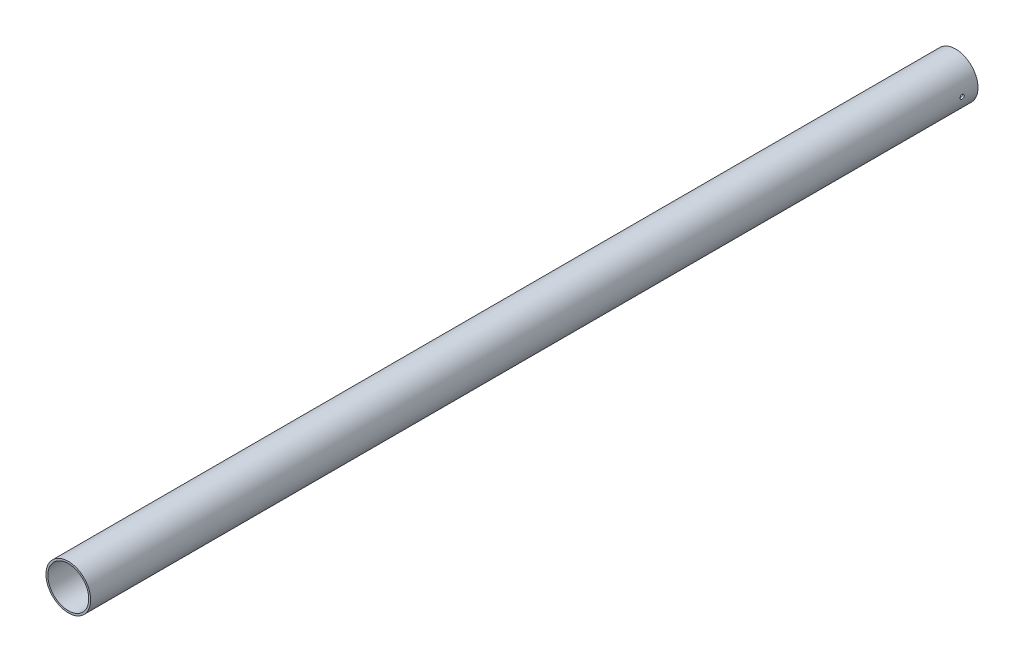
ISO-10303-21;
HEADER;
FILE_DESCRIPTION(('STEP AP214'),'2;1');
FILE_NAME('part.step','',(''),(''),'','','');
FILE_SCHEMA(('AUTOMOTIVE_DESIGN { 1 0 10303 214 1 1 1 1 }'));
ENDSEC;
DATA;
#1=APPLICATION_CONTEXT('core data for automotive mechanical design processes');
#2=APPLICATION_PROTOCOL_DEFINITION('international standard','automotive_design',2000,#1);
#3=PRODUCT_CONTEXT('',#1,'mechanical');
#4=PRODUCT('Part','Part','',(#3));
#5=PRODUCT_RELATED_PRODUCT_CATEGORY('part','',(#4));
#6=PRODUCT_DEFINITION_FORMATION('','',#4);
#7=PRODUCT_DEFINITION_CONTEXT('part definition',#1,'design');
#8=PRODUCT_DEFINITION('design','',#6,#7);
#9=PRODUCT_DEFINITION_SHAPE('','',#8);
#10=(LENGTH_UNIT() NAMED_UNIT(*) SI_UNIT(.MILLI.,.METRE.));
#11=(NAMED_UNIT(*) PLANE_ANGLE_UNIT() SI_UNIT($,.RADIAN.));
#12=(NAMED_UNIT(*) SI_UNIT($,.STERADIAN.) SOLID_ANGLE_UNIT());
#13=UNCERTAINTY_MEASURE_WITH_UNIT(LENGTH_MEASURE(1.E-05),#10,'distance_accuracy_value','');
#14=(GEOMETRIC_REPRESENTATION_CONTEXT(3) GLOBAL_UNCERTAINTY_ASSIGNED_CONTEXT((#13)) GLOBAL_UNIT_ASSIGNED_CONTEXT((#10,
#11,#12)) REPRESENTATION_CONTEXT('',''));
#15=CARTESIAN_POINT('',(0.,0.,0.));
#16=DIRECTION('',(0.,0.,1.));
#17=DIRECTION('',(1.,0.,0.));
#18=AXIS2_PLACEMENT_3D('',#15,#16,#17);
#19=CARTESIAN_POINT('',(0.,0.,504.28));
#20=DIRECTION('',(0.,0.,1.));
#21=DIRECTION('',(1.,0.,0.));
#22=AXIS2_PLACEMENT_3D('',#19,#20,#21);
#23=PLANE('',#22);
#24=CARTESIAN_POINT('',(0.,0.,504.28));
#25=DIRECTION('',(0.,0.,1.));
#26=DIRECTION('',(1.,0.,0.));
#27=AXIS2_PLACEMENT_3D('',#24,#25,#26);
#28=CIRCLE('',#27,12.7);
#29=CARTESIAN_POINT('',(12.7,0.,504.28));
#30=VERTEX_POINT('',#29);
#31=EDGE_CURVE('E47',#30,#30,#28,.T.);
#32=ORIENTED_EDGE('',*,*,#31,.T.);
#33=EDGE_LOOP('',(#32));
#34=FACE_BOUND('',#33,.T.);
#35=CARTESIAN_POINT('',(0.,0.,504.28));
#36=DIRECTION('',(0.,0.,1.));
#37=DIRECTION('',(1.,0.,0.));
#38=AXIS2_PLACEMENT_3D('',#35,#36,#37);
#39=CIRCLE('',#38,11.6205);
#40=CARTESIAN_POINT('',(11.6205,0.,504.28));
#41=VERTEX_POINT('',#40);
#42=EDGE_CURVE('E82',#41,#41,#39,.T.);
#43=ORIENTED_EDGE('',*,*,#42,.F.);
#44=EDGE_LOOP('',(#43));
#45=FACE_BOUND('',#44,.T.);
#46=ADVANCED_FACE('F31',(#34,#45),#23,.T.);
#47=CARTESIAN_POINT('',(0.,0.,0.));
#48=DIRECTION('',(0.,0.,1.));
#49=DIRECTION('',(1.,0.,0.));
#50=AXIS2_PLACEMENT_3D('',#47,#48,#49);
#51=PLANE('',#50);
#52=CARTESIAN_POINT('',(0.,0.,0.));
#53=DIRECTION('',(0.,0.,1.));
#54=DIRECTION('',(1.,0.,0.));
#55=AXIS2_PLACEMENT_3D('',#52,#53,#54);
#56=CIRCLE('',#55,12.7);
#57=CARTESIAN_POINT('',(12.7,0.,0.));
#58=VERTEX_POINT('',#57);
#59=EDGE_CURVE('E51',#58,#58,#56,.T.);
#60=ORIENTED_EDGE('',*,*,#59,.F.);
#61=EDGE_LOOP('',(#60));
#62=FACE_BOUND('',#61,.T.);
#63=CARTESIAN_POINT('',(0.,0.,0.));
#64=DIRECTION('',(0.,0.,1.));
#65=DIRECTION('',(1.,0.,0.));
#66=AXIS2_PLACEMENT_3D('',#63,#64,#65);
#67=CIRCLE('',#66,11.6205);
#68=CARTESIAN_POINT('',(11.6205,0.,0.));
#69=VERTEX_POINT('',#68);
#70=EDGE_CURVE('E77',#69,#69,#67,.T.);
#71=ORIENTED_EDGE('',*,*,#70,.T.);
#72=EDGE_LOOP('',(#71));
#73=FACE_BOUND('',#72,.T.);
#74=ADVANCED_FACE('F88',(#62,#73),#51,.F.);
#75=CARTESIAN_POINT('',(0.,0.,504.28));
#76=DIRECTION('',(0.,0.,-1.));
#77=DIRECTION('',(-1.,0.,0.));
#78=AXIS2_PLACEMENT_3D('',#75,#76,#77);
#79=CYLINDRICAL_SURFACE('',#78,12.7);
#80=CARTESIAN_POINT('',(-12.7,0.,7.8));
#81=CARTESIAN_POINT('',(-12.6999992647351,0.0672436645791881,7.80000292110959));
#82=CARTESIAN_POINT('',(-12.6994602583645,0.134532250113994,7.80567116161042));
#83=CARTESIAN_POINT('',(-12.6973618829489,0.267245238753763,7.82819805892377));
#84=CARTESIAN_POINT('',(-12.6958013786043,0.332667483068381,7.84506916697964));
#85=CARTESIAN_POINT('',(-12.6918362274279,0.459706661698656,7.88950742482808));
#86=CARTESIAN_POINT('',(-12.6894320792388,0.521325818618373,7.91706825737999));
#87=CARTESIAN_POINT('',(-12.6840487416453,0.63904956472979,7.98209167980071));
#88=CARTESIAN_POINT('',(-12.6810696696504,0.695155276339263,8.01955224854545));
#89=CARTESIAN_POINT('',(-12.6748596357844,0.800454668942981,8.10344191042882));
#90=CARTESIAN_POINT('',(-12.6716279754825,0.849628048880857,8.1498964363571));
#91=CARTESIAN_POINT('',(-12.6652827978562,0.939492536562182,8.25040123796989));
#92=CARTESIAN_POINT('',(-12.6621692859032,0.980183259034829,8.30445185847214));
#93=CARTESIAN_POINT('',(-12.6564056786671,1.05199827487853,8.41874031392843));
#94=CARTESIAN_POINT('',(-12.6537564692717,1.08310436467755,8.47898963589863));
#95=CARTESIAN_POINT('',(-12.6492298785415,1.13475088033833,8.60388544776417));
#96=CARTESIAN_POINT('',(-12.6473524800529,1.15529154102306,8.66853183989585));
#97=CARTESIAN_POINT('',(-12.6445882565911,1.18516434657597,8.80018078070263));
#98=CARTESIAN_POINT('',(-12.6436984725554,1.19452998010332,8.86717566721294));
#99=CARTESIAN_POINT('',(-12.6430009858318,1.2018903732235,9.0017919315644));
#100=CARTESIAN_POINT('',(-12.64319325756,1.19988540166057,9.06941329455553));
#101=CARTESIAN_POINT('',(-12.644635459794,1.18458912582194,9.20313261711031));
#102=CARTESIAN_POINT('',(-12.6458819693004,1.17133432672263,9.26923479460722));
#103=CARTESIAN_POINT('',(-12.6492868463526,1.1339714218254,9.39827206357135));
#104=CARTESIAN_POINT('',(-12.6514452250248,1.10986318359523,9.46120711638331));
#105=CARTESIAN_POINT('',(-12.6564345841342,1.05143724752191,9.58223931649146));
#106=CARTESIAN_POINT('',(-12.6592666343216,1.01710328976211,9.64032856873999));
#107=CARTESIAN_POINT('',(-12.6652833045372,0.939212226192871,9.74993385326778));
#108=CARTESIAN_POINT('',(-12.6684679337701,0.895654879561493,9.80144971386001));
#109=CARTESIAN_POINT('',(-12.6748461723438,0.800349280584357,9.89665804404941));
#110=CARTESIAN_POINT('',(-12.6780397677479,0.748569490103312,9.94031895044983));
#111=CARTESIAN_POINT('',(-12.6840642400147,0.638398534577093,10.0183335706764));
#112=CARTESIAN_POINT('',(-12.6868951165338,0.580007363270718,10.0526872756883));
#113=CARTESIAN_POINT('',(-12.6918759754523,0.458249762567131,10.1111108065502));
#114=CARTESIAN_POINT('',(-12.6940258565343,0.39488259459694,10.1351791023379));
#115=CARTESIAN_POINT('',(-12.6974014179635,0.264981758608645,10.1723258349013));
#116=CARTESIAN_POINT('',(-12.6986271229789,0.198448175158765,10.185404565011));
#117=CARTESIAN_POINT('',(-12.7000130615517,0.0643765766885857,10.2001610317479));
#118=CARTESIAN_POINT('',(-12.700177366823,-0.00315660256509824,10.2018823379735));
#119=CARTESIAN_POINT('',(-12.699432896081,-0.137550513798226,10.1939894255829));
#120=CARTESIAN_POINT('',(-12.6985241329862,-0.204411253863348,10.1843753434327));
#121=CARTESIAN_POINT('',(-12.695738284362,-0.335437135549339,10.1541206969873));
#122=CARTESIAN_POINT('',(-12.6938629842485,-0.399607012285763,10.1335004610956));
#123=CARTESIAN_POINT('',(-12.6893545416645,-0.523576627788468,10.081839685859));
#124=CARTESIAN_POINT('',(-12.6867213839395,-0.583376278558557,10.0507989367634));
#125=CARTESIAN_POINT('',(-12.6809818377794,-0.69710539349013,9.97906971127578));
#126=CARTESIAN_POINT('',(-12.677874051145,-0.751016678858039,9.93835252544696));
#127=CARTESIAN_POINT('',(-12.671538680543,-0.851254884069771,9.84846750987874));
#128=CARTESIAN_POINT('',(-12.6683110938964,-0.897581634190501,9.7992994910811));
#129=CARTESIAN_POINT('',(-12.662087709054,-0.981486362284095,9.69371876400525));
#130=CARTESIAN_POINT('',(-12.6590926875178,-1.01903580222673,9.63728332443466));
#131=CARTESIAN_POINT('',(-12.6536850894959,-1.08412401495575,9.51888222746228));
#132=CARTESIAN_POINT('',(-12.6512725057894,-1.11166291185015,9.45691663863365));
#133=CARTESIAN_POINT('',(-12.6473076389668,-1.15590024040374,9.32931320204592));
#134=CARTESIAN_POINT('',(-12.6457539952817,-1.17261582352431,9.26368134434372));
#135=CARTESIAN_POINT('',(-12.6436785869436,-1.19478774945327,9.13052713180316));
#136=CARTESIAN_POINT('',(-12.6431567961441,-1.20024437755629,9.06300482491151));
#137=CARTESIAN_POINT('',(-12.6432046673143,-1.19973977686572,8.92827005230846));
#138=CARTESIAN_POINT('',(-12.6437700436999,-1.19382338026117,8.86105741265753));
#139=CARTESIAN_POINT('',(-12.6459194194394,-1.17083449453073,8.72858526111938));
#140=CARTESIAN_POINT('',(-12.647503420095,-1.15376199114879,8.6633257517281));
#141=CARTESIAN_POINT('',(-12.6515104007557,-1.10895754365353,8.53661155895532));
#142=CARTESIAN_POINT('',(-12.6539332907887,-1.08122674262402,8.47515646837689));
#143=CARTESIAN_POINT('',(-12.6593452297627,-1.01589760947404,8.35776621977284));
#144=CARTESIAN_POINT('',(-12.662334273539,-0.978299367367613,8.30183101139945));
#145=CARTESIAN_POINT('',(-12.6685558185134,-0.894134111279764,8.196838600714));
#146=CARTESIAN_POINT('',(-12.6717891970951,-0.847533739505933,8.14780819064974));
#147=CARTESIAN_POINT('',(-12.6781270617199,-0.746751576404293,8.0582424423319));
#148=CARTESIAN_POINT('',(-12.6812315165959,-0.692567965517046,8.01770914876575));
#149=CARTESIAN_POINT('',(-12.6869689662881,-0.578024127382161,7.94621723636115));
#150=CARTESIAN_POINT('',(-12.6896008678755,-0.51765007272362,7.91528070193364));
#151=CARTESIAN_POINT('',(-12.6940845081993,-0.39257889087562,7.86402498077978));
#152=CARTESIAN_POINT('',(-12.6959371321351,-0.327886766038709,7.84369374091456));
#153=CARTESIAN_POINT('',(-12.6981844213502,-0.21901908840564,7.81933347671279));
#154=CARTESIAN_POINT('',(-12.6988621150258,-0.175541004145001,7.81209323382703));
#155=CARTESIAN_POINT('',(-12.6997701442889,-0.0880483662317025,7.80242554767123));
#156=CARTESIAN_POINT('',(-12.7000004814806,-0.0440338145034741,7.79999808714176));
#157=CARTESIAN_POINT('',(-12.7,0.,7.8));
#158=B_SPLINE_CURVE_WITH_KNOTS('',3,(#80,#81,#82,#83,#84,#85,#86,#87,#88,#89,#90,#91,#92,#93,
#94,#95,#96,#97,#98,#99,#100,#101,#102,#103,#104,#105,#106,#107,#108,#109,#110,#111,#112,#113,
#114,#115,#116,#117,#118,#119,#120,#121,#122,#123,#124,#125,#126,#127,#128,#129,#130,#131,#132,
#133,#134,#135,#136,#137,#138,#139,#140,#141,#142,#143,#144,#145,#146,#147,#148,#149,#150,#151,
#152,#153,#154,#155,#156,#157),.UNSPECIFIED.,.T.,.F.,(4,2,2,2,2,2,2,2,2,2,2,2,2,2,2,2,2,2,2,2,2,
2,2,2,2,2,2,2,2,2,2,2,2,2,2,2,2,2,4),(0.,0.201570207034533,0.403364821789229,0.605040364479121,
0.806674764979918,1.0088878949915,1.21111020724929,1.41371425510745,1.61631379977508,
1.81830466893997,2.02029076229449,2.2216239149406,2.42295952429426,2.62461700233744,
2.82627974629062,3.02873555451505,3.23119155447361,3.43367766140465,3.63615836339395,
3.83786185059291,4.03956290952137,4.24089270855193,4.44222656031969,4.64416538445326,
4.84610872685956,5.04869979653931,5.25128835446376,5.45355508403256,5.65581668823045,
5.85728261681534,6.05874880284791,6.26019338801046,6.46163613559342,6.66384017563344,
6.86609281694631,7.06880749458907,7.27129127801421,7.40328790538686,7.53528405939677),.UNSPECIFIED.);
#159=CARTESIAN_POINT('',(-12.7,0.,7.8));
#160=VERTEX_POINT('',#159);
#161=EDGE_CURVE('E10',#160,#160,#158,.T.);
#162=ORIENTED_EDGE('',*,*,#161,.T.);
#163=EDGE_LOOP('',(#162));
#164=FACE_BOUND('',#163,.T.);
#165=CARTESIAN_POINT('',(12.7,0.,10.2));
#166=CARTESIAN_POINT('',(12.6999992647351,0.0672436645791882,10.1999970788904));
#167=CARTESIAN_POINT('',(12.6994602583645,0.134532250113994,10.1943288383896));
#168=CARTESIAN_POINT('',(12.6973618829489,0.267245238753763,10.1718019410762));
#169=CARTESIAN_POINT('',(12.6958013786043,0.332667483068382,10.1549308330204));
#170=CARTESIAN_POINT('',(12.6918362274279,0.459706661698656,10.1104925751719));
#171=CARTESIAN_POINT('',(12.6894320792388,0.521325818618373,10.08293174262));
#172=CARTESIAN_POINT('',(12.6840487416453,0.63904956472979,10.0179083201993));
#173=CARTESIAN_POINT('',(12.6810696696504,0.695155276339263,9.98044775145455));
#174=CARTESIAN_POINT('',(12.6748596357844,0.800454668942981,9.89655808957117));
#175=CARTESIAN_POINT('',(12.6716279754825,0.849628048880857,9.8501035636429));
#176=CARTESIAN_POINT('',(12.6652827978562,0.939492536562182,9.74959876203011));
#177=CARTESIAN_POINT('',(12.6621692859032,0.980183259034829,9.69554814152786));
#178=CARTESIAN_POINT('',(12.6564056786671,1.05199827487853,9.58125968607156));
#179=CARTESIAN_POINT('',(12.6537564692717,1.08310436467755,9.52101036410136));
#180=CARTESIAN_POINT('',(12.6492298785415,1.13475088033833,9.39611455223582));
#181=CARTESIAN_POINT('',(12.6473524800529,1.15529154102306,9.33146816010414));
#182=CARTESIAN_POINT('',(12.6445882565911,1.18516434657597,9.19981921929736));
#183=CARTESIAN_POINT('',(12.6436984725554,1.19452998010332,9.13282433278706));
#184=CARTESIAN_POINT('',(12.6430009858318,1.2018903732235,8.9982080684356));
#185=CARTESIAN_POINT('',(12.64319325756,1.19988540166057,8.93058670544446));
#186=CARTESIAN_POINT('',(12.644635459794,1.18458912582194,8.79686738288969));
#187=CARTESIAN_POINT('',(12.6458819693004,1.17133432672263,8.73076520539277));
#188=CARTESIAN_POINT('',(12.6492868463526,1.1339714218254,8.60172793642865));
#189=CARTESIAN_POINT('',(12.6514452250248,1.10986318359523,8.53879288361669));
#190=CARTESIAN_POINT('',(12.6564345841342,1.05143724752191,8.41776068350854));
#191=CARTESIAN_POINT('',(12.6592666343216,1.01710328976211,8.35967143126001));
#192=CARTESIAN_POINT('',(12.6652833045372,0.939212226192871,8.25006614673222));
#193=CARTESIAN_POINT('',(12.6684679337701,0.895654879561493,8.19855028613999));
#194=CARTESIAN_POINT('',(12.6748461723438,0.800349280584357,8.10334195595059));
#195=CARTESIAN_POINT('',(12.6780397677479,0.748569490103312,8.05968104955017));
#196=CARTESIAN_POINT('',(12.6840642400147,0.638398534577093,7.98166642932355));
#197=CARTESIAN_POINT('',(12.6868951165338,0.580007363270718,7.94731272431169));
#198=CARTESIAN_POINT('',(12.6918759754523,0.458249762567131,7.88888919344984));
#199=CARTESIAN_POINT('',(12.6940258565343,0.39488259459694,7.86482089766205));
#200=CARTESIAN_POINT('',(12.6974014179635,0.264981758608645,7.82767416509869));
#201=CARTESIAN_POINT('',(12.6986271229789,0.198448175158765,7.81459543498905));
#202=CARTESIAN_POINT('',(12.7000130615517,0.0643765766885853,7.79983896825208));
#203=CARTESIAN_POINT('',(12.700177366823,-0.00315660256509866,7.79811766202649));
#204=CARTESIAN_POINT('',(12.699432896081,-0.137550513798226,7.80601057441712));
#205=CARTESIAN_POINT('',(12.6985241329862,-0.204411253863348,7.81562465656734));
#206=CARTESIAN_POINT('',(12.695738284362,-0.33543713554934,7.84587930301268));
#207=CARTESIAN_POINT('',(12.6938629842485,-0.399607012285764,7.86649953890442));
#208=CARTESIAN_POINT('',(12.6893545416645,-0.523576627788469,7.918160314141));
#209=CARTESIAN_POINT('',(12.6867213839395,-0.583376278558557,7.94920106323655));
#210=CARTESIAN_POINT('',(12.6809818377794,-0.697105393490131,8.02093028872422));
#211=CARTESIAN_POINT('',(12.677874051145,-0.751016678858039,8.06164747455304));
#212=CARTESIAN_POINT('',(12.671538680543,-0.851254884069771,8.15153249012126));
#213=CARTESIAN_POINT('',(12.6683110938964,-0.897581634190501,8.2007005089189));
#214=CARTESIAN_POINT('',(12.662087709054,-0.981486362284096,8.30628123599475));
#215=CARTESIAN_POINT('',(12.6590926875178,-1.01903580222673,8.36271667556534));
#216=CARTESIAN_POINT('',(12.6536850894959,-1.08412401495575,8.48111777253772));
#217=CARTESIAN_POINT('',(12.6512725057894,-1.11166291185015,8.54308336136635));
#218=CARTESIAN_POINT('',(12.6473076389668,-1.15590024040374,8.67068679795408));
#219=CARTESIAN_POINT('',(12.6457539952817,-1.17261582352431,8.73631865565628));
#220=CARTESIAN_POINT('',(12.6436785869436,-1.19478774945327,8.86947286819684));
#221=CARTESIAN_POINT('',(12.6431567961441,-1.20024437755629,8.93699517508849));
#222=CARTESIAN_POINT('',(12.6432046673143,-1.19973977686572,9.07172994769154));
#223=CARTESIAN_POINT('',(12.6437700436999,-1.19382338026117,9.13894258734246));
#224=CARTESIAN_POINT('',(12.6459194194394,-1.17083449453073,9.27141473888062));
#225=CARTESIAN_POINT('',(12.647503420095,-1.15376199114879,9.3366742482719));
#226=CARTESIAN_POINT('',(12.6515104007557,-1.10895754365353,9.46338844104468));
#227=CARTESIAN_POINT('',(12.6539332907887,-1.08122674262402,9.52484353162311));
#228=CARTESIAN_POINT('',(12.6593452297627,-1.01589760947404,9.64223378022716));
#229=CARTESIAN_POINT('',(12.662334273539,-0.978299367367613,9.69816898860055));
#230=CARTESIAN_POINT('',(12.6685558185134,-0.894134111279764,9.803161399286));
#231=CARTESIAN_POINT('',(12.6717891970951,-0.847533739505933,9.85219180935026));
#232=CARTESIAN_POINT('',(12.6781270617199,-0.746751576404293,9.9417575576681));
#233=CARTESIAN_POINT('',(12.6812315165959,-0.692567965517046,9.98229085123425));
#234=CARTESIAN_POINT('',(12.6869689662881,-0.578024127382162,10.0537827636388));
#235=CARTESIAN_POINT('',(12.6896008678755,-0.51765007272362,10.0847192980664));
#236=CARTESIAN_POINT('',(12.6940845081993,-0.39257889087562,10.1359750192202));
#237=CARTESIAN_POINT('',(12.6959371321351,-0.32788676603871,10.1563062590854));
#238=CARTESIAN_POINT('',(12.6981844213502,-0.21901908840564,10.1806665232872));
#239=CARTESIAN_POINT('',(12.6988621150258,-0.175541004145001,10.187906766173));
#240=CARTESIAN_POINT('',(12.6997701442889,-0.0880483662317023,10.1975744523288));
#241=CARTESIAN_POINT('',(12.7000004814806,-0.044033814503474,10.2000019128582));
#242=CARTESIAN_POINT('',(12.7,0.,10.2));
#243=B_SPLINE_CURVE_WITH_KNOTS('',3,(#165,#166,#167,#168,#169,#170,#171,#172,#173,#174,#175,
#176,#177,#178,#179,#180,#181,#182,#183,#184,#185,#186,#187,#188,#189,#190,#191,#192,#193,#194,
#195,#196,#197,#198,#199,#200,#201,#202,#203,#204,#205,#206,#207,#208,#209,#210,#211,#212,#213,
#214,#215,#216,#217,#218,#219,#220,#221,#222,#223,#224,#225,#226,#227,#228,#229,#230,#231,#232,
#233,#234,#235,#236,#237,#238,#239,#240,#241,#242),.UNSPECIFIED.,.T.,.F.,(4,2,2,2,2,2,2,2,2,2,2,
2,2,2,2,2,2,2,2,2,2,2,2,2,2,2,2,2,2,2,2,2,2,2,2,2,2,2,4),(0.,0.201570207034533,
0.403364821789229,0.605040364479121,0.806674764979918,1.0088878949915,1.21111020724929,
1.41371425510745,1.61631379977508,1.81830466893998,2.02029076229449,2.2216239149406,
2.42295952429426,2.62461700233744,2.82627974629062,3.02873555451505,3.23119155447361,
3.43367766140465,3.63615836339395,3.83786185059291,4.03956290952137,4.24089270855193,
4.44222656031969,4.64416538445326,4.84610872685956,5.04869979653932,5.25128835446376,
5.45355508403256,5.65581668823045,5.85728261681534,6.05874880284791,6.26019338801046,
6.46163613559342,6.66384017563344,6.86609281694631,7.06880749458907,7.27129127801421,
7.40328790538686,7.53528405939677),.UNSPECIFIED.);
#244=CARTESIAN_POINT('',(12.7,0.,10.2));
#245=VERTEX_POINT('',#244);
#246=EDGE_CURVE('E43',#245,#245,#243,.T.);
#247=ORIENTED_EDGE('',*,*,#246,.T.);
#248=EDGE_LOOP('',(#247));
#249=FACE_BOUND('',#248,.T.);
#250=ORIENTED_EDGE('',*,*,#31,.F.);
#251=EDGE_LOOP('',(#250));
#252=FACE_BOUND('',#251,.T.);
#253=ORIENTED_EDGE('',*,*,#59,.T.);
#254=EDGE_LOOP('',(#253));
#255=FACE_BOUND('',#254,.T.);
#256=ADVANCED_FACE('F33',(#164,#249,#252,#255),#79,.T.);
#257=CARTESIAN_POINT('',(0.,0.,504.28));
#258=DIRECTION('',(0.,0.,-1.));
#259=DIRECTION('',(-1.,0.,0.));
#260=AXIS2_PLACEMENT_3D('',#257,#258,#259);
#261=CYLINDRICAL_SURFACE('',#260,11.6205);
#262=CARTESIAN_POINT('',(-11.6205,0.,10.2));
#263=CARTESIAN_POINT('',(-11.6204992038423,-0.0672125181851825,10.1999970953361));
#264=CARTESIAN_POINT('',(-11.6199106762744,-0.134469186673739,10.194334081336));
#265=CARTESIAN_POINT('',(-11.6176195171319,-0.267117090348463,10.1718291585458));
#266=CARTESIAN_POINT('',(-11.6159156657229,-0.332506201164537,10.1549750096744));
#267=CARTESIAN_POINT('',(-11.6115861475893,-0.45947897111501,10.1105844114608));
#268=CARTESIAN_POINT('',(-11.6089610452713,-0.521064933152808,10.0830545015693));
#269=CARTESIAN_POINT('',(-11.6030823718001,-0.638728756318107,10.0181067482352));
#270=CARTESIAN_POINT('',(-11.5998289236115,-0.694807691913816,9.98069083891475));
#271=CARTESIAN_POINT('',(-11.5930439491489,-0.800093299021603,9.89687968643869));
#272=CARTESIAN_POINT('',(-11.5895115143825,-0.849275938513217,9.85045432436527));
#273=CARTESIAN_POINT('',(-11.5825741839121,-0.939166231681752,9.75000642301018));
#274=CARTESIAN_POINT('',(-11.5791692941808,-0.979873488880333,9.69598352851397));
#275=CARTESIAN_POINT('',(-11.5728633319526,-1.05174318451593,9.58172289888097));
#276=CARTESIAN_POINT('',(-11.5699634191115,-1.08288377557799,9.52147135230016));
#277=CARTESIAN_POINT('',(-11.5650071121611,-1.13459666913028,9.39655940826942));
#278=CARTESIAN_POINT('',(-11.5629506959099,-1.15516924903619,9.3318991266015));
#279=CARTESIAN_POINT('',(-11.5599224939468,-1.18509065781283,9.20025087782907));
#280=CARTESIAN_POINT('',(-11.5589468476618,-1.19447944495643,9.1332720828586));
#281=CARTESIAN_POINT('',(-11.5581786896727,-1.2018902886349,8.99868283345914));
#282=CARTESIAN_POINT('',(-11.5583861449333,-1.1999126625487,8.93107239671981));
#283=CARTESIAN_POINT('',(-11.5599572236431,-1.18467973566489,8.79741487698642));
#284=CARTESIAN_POINT('',(-11.5613163696088,-1.17146810913993,8.73136275640326));
#285=CARTESIAN_POINT('',(-11.5650306958371,-1.13421018916511,8.60241837210571));
#286=CARTESIAN_POINT('',(-11.5673858903575,-1.1101637406209,8.53952615363784));
#287=CARTESIAN_POINT('',(-11.5728320866751,-1.05187070917432,8.41854915875891));
#288=CARTESIAN_POINT('',(-11.5759244806058,-1.01760479663611,8.36047376159529));
#289=CARTESIAN_POINT('',(-11.582495476541,-0.939859402777191,8.25088160854655));
#290=CARTESIAN_POINT('',(-11.5859740906016,-0.896379633800532,8.19936505750854));
#291=CARTESIAN_POINT('',(-11.5929455219165,-0.801197049477811,8.10409920679147));
#292=CARTESIAN_POINT('',(-11.5964383290318,-0.749456524510395,8.06038757418467));
#293=CARTESIAN_POINT('',(-11.6030291645463,-0.63935196351974,7.98226447933885));
#294=CARTESIAN_POINT('',(-11.6061271924571,-0.580987919301705,7.94785302860644));
#295=CARTESIAN_POINT('',(-11.6115805217569,-0.459266614835023,7.88930844198384));
#296=CARTESIAN_POINT('',(-11.6139356812055,-0.39590840323433,7.86517727004539));
#297=CARTESIAN_POINT('',(-11.6176364842742,-0.266009809918713,7.82790611266701));
#298=CARTESIAN_POINT('',(-11.6189821600937,-0.199469529773554,7.81476577665325));
#299=CARTESIAN_POINT('',(-11.6205082323637,-0.0654217711977601,7.79989720449923));
#300=CARTESIAN_POINT('',(-11.6206939350462,0.00207988513522879,7.79811700125993));
#301=CARTESIAN_POINT('',(-11.6198933772271,0.136420586397389,7.80588266080431));
#302=CARTESIAN_POINT('',(-11.6189071336289,0.20325964086938,7.8154283602322));
#303=CARTESIAN_POINT('',(-11.6158768905829,0.33422743543872,7.84553173761693));
#304=CARTESIAN_POINT('',(-11.6138352337784,0.398361839304932,7.86606503054404));
#305=CARTESIAN_POINT('',(-11.6089231512165,0.522275979426399,7.91753563568623));
#306=CARTESIAN_POINT('',(-11.6060527057147,0.582055611895209,7.94847319576562));
#307=CARTESIAN_POINT('',(-11.5997907708419,0.695797907184917,8.02000263720679));
#308=CARTESIAN_POINT('',(-11.5963974574374,0.749739035422661,8.06062859943978));
#309=CARTESIAN_POINT('',(-11.5894762589774,0.85005501671239,8.15033283452385));
#310=CARTESIAN_POINT('',(-11.5859483703179,0.896429666945258,8.19941133387236));
#311=CARTESIAN_POINT('',(-11.5791396224576,0.980477190999694,8.30485449462328));
#312=CARTESIAN_POINT('',(-11.5758597653431,1.01811591753233,8.36124644829957));
#313=CARTESIAN_POINT('',(-11.5699338282386,1.08338828858842,8.47958140242207));
#314=CARTESIAN_POINT('',(-11.567287739087,1.1110220777431,8.54152432260747));
#315=CARTESIAN_POINT('',(-11.5629352624361,1.15544320730908,8.66908659203437));
#316=CARTESIAN_POINT('',(-11.5612271265136,1.17225073896339,8.73469884792047));
#317=CARTESIAN_POINT('',(-11.5589385757209,1.19460770837715,8.86783280079622));
#318=CARTESIAN_POINT('',(-11.5583581261636,1.20015749241893,8.93535443898951));
#319=CARTESIAN_POINT('',(-11.5583914317392,1.19983644091773,9.07005103352647));
#320=CARTESIAN_POINT('',(-11.5589995779227,1.19401924585189,9.13722612553509));
#321=CARTESIAN_POINT('',(-11.5613295807501,1.17124196628742,9.26963920642339));
#322=CARTESIAN_POINT('',(-11.5630514385338,1.1542818703845,9.33487719332045));
#323=CARTESIAN_POINT('',(-11.5674132772164,1.10971526622723,9.46156298990711));
#324=CARTESIAN_POINT('',(-11.5700531117591,1.08211045502145,9.52301140194455));
#325=CARTESIAN_POINT('',(-11.5759537505419,1.01704350248294,9.6404114200308));
#326=CARTESIAN_POINT('',(-11.5792145526524,0.979581394953524,9.69636304492867));
#327=CARTESIAN_POINT('',(-11.5860081546658,0.89566203233042,9.80145609704216));
#328=CARTESIAN_POINT('',(-11.5895421200493,0.849164789220496,9.85056551848437));
#329=CARTESIAN_POINT('',(-11.5964732486946,0.748574963634493,9.94030792263548));
#330=CARTESIAN_POINT('',(-11.5998703790528,0.694480568195118,9.98093887629641));
#331=CARTESIAN_POINT('',(-11.6061545706277,0.580073096903424,10.0526571986532));
#332=CARTESIAN_POINT('',(-11.6090402485313,0.519743834123639,10.0837188478657));
#333=CARTESIAN_POINT('',(-11.6139615248196,0.394733979829618,10.1352291786812));
#334=CARTESIAN_POINT('',(-11.6159980770845,0.330058366259914,10.1556897754698));
#335=CARTESIAN_POINT('',(-11.6184823532737,0.220850142547215,10.1803392544273));
#336=CARTESIAN_POINT('',(-11.6192354241306,0.177014621281277,10.1877018995775));
#337=CARTESIAN_POINT('',(-11.6202445093851,0.088792488849783,10.1975332209513));
#338=CARTESIAN_POINT('',(-11.6205005260045,0.0444058801483485,10.2000019190496));
#339=CARTESIAN_POINT('',(-11.6205,0.,10.2));
#340=B_SPLINE_CURVE_WITH_KNOTS('',3,(#262,#263,#264,#265,#266,#267,#268,#269,#270,#271,#272,
#273,#274,#275,#276,#277,#278,#279,#280,#281,#282,#283,#284,#285,#286,#287,#288,#289,#290,#291,
#292,#293,#294,#295,#296,#297,#298,#299,#300,#301,#302,#303,#304,#305,#306,#307,#308,#309,#310,
#311,#312,#313,#314,#315,#316,#317,#318,#319,#320,#321,#322,#323,#324,#325,#326,#327,#328,#329,
#330,#331,#332,#333,#334,#335,#336,#337,#338,#339),.UNSPECIFIED.,.T.,.F.,(4,2,2,2,2,2,2,2,2,2,2,
2,2,2,2,2,2,2,2,2,2,2,2,2,2,2,2,2,2,2,2,2,2,2,2,2,2,2,4),(0.,0.201475395487696,0.40317151446012,
0.604744278888133,0.806277636270348,1.00849670855987,1.21072523853216,1.41341222192199,
1.61609388440343,1.81804919792882,2.01999887237976,2.22116700064646,2.42233800861251,
2.6238919616698,2.82545220815474,3.02796034937364,3.23046874114381,3.43301580293058,
3.63555640384348,3.83716981151566,4.03878031131202,4.23994521661209,4.44111491467,
4.64300298560269,4.84489646724766,5.04756630409765,5.2502332110386,5.45252103622867,
5.65480263905826,5.85613198528638,6.05746153756685,6.25875900586418,6.46005578386743,
6.6622646398562,6.86452183265715,7.06731798408248,7.26988570305454,7.40299680343087,
7.53610730883133),.UNSPECIFIED.);
#341=CARTESIAN_POINT('',(-11.6205,0.,10.2));
#342=VERTEX_POINT('',#341);
#343=EDGE_CURVE('E78',#342,#342,#340,.T.);
#344=ORIENTED_EDGE('',*,*,#343,.F.);
#345=EDGE_LOOP('',(#344));
#346=FACE_BOUND('',#345,.T.);
#347=CARTESIAN_POINT('',(11.6205,0.,10.2));
#348=CARTESIAN_POINT('',(11.6204992038423,0.067212518185183,10.1999970953361));
#349=CARTESIAN_POINT('',(11.6199106762744,0.13446918667374,10.194334081336));
#350=CARTESIAN_POINT('',(11.6176195171319,0.267117090348464,10.1718291585458));
#351=CARTESIAN_POINT('',(11.6159156657229,0.332506201164537,10.1549750096744));
#352=CARTESIAN_POINT('',(11.6115861475893,0.45947897111501,10.1105844114608));
#353=CARTESIAN_POINT('',(11.6089610452713,0.521064933152808,10.0830545015693));
#354=CARTESIAN_POINT('',(11.6030823718001,0.638728756318107,10.0181067482352));
#355=CARTESIAN_POINT('',(11.5998289236115,0.694807691913816,9.98069083891475));
#356=CARTESIAN_POINT('',(11.5930439491489,0.800093299021604,9.89687968643869));
#357=CARTESIAN_POINT('',(11.5895115143825,0.849275938513217,9.85045432436527));
#358=CARTESIAN_POINT('',(11.5825741839121,0.939166231681753,9.75000642301018));
#359=CARTESIAN_POINT('',(11.5791692941808,0.979873488880333,9.69598352851396));
#360=CARTESIAN_POINT('',(11.5728633319526,1.05174318451593,9.58172289888097));
#361=CARTESIAN_POINT('',(11.5699634191115,1.08288377557799,9.52147135230016));
#362=CARTESIAN_POINT('',(11.5650071121611,1.13459666913028,9.39655940826942));
#363=CARTESIAN_POINT('',(11.5629506959099,1.15516924903619,9.3318991266015));
#364=CARTESIAN_POINT('',(11.5599224939468,1.18509065781283,9.20025087782907));
#365=CARTESIAN_POINT('',(11.5589468476618,1.19447944495643,9.1332720828586));
#366=CARTESIAN_POINT('',(11.5581786896727,1.2018902886349,8.99868283345914));
#367=CARTESIAN_POINT('',(11.5583861449333,1.1999126625487,8.93107239671981));
#368=CARTESIAN_POINT('',(11.5599572236431,1.18467973566489,8.79741487698642));
#369=CARTESIAN_POINT('',(11.5613163696088,1.17146810913993,8.73136275640326));
#370=CARTESIAN_POINT('',(11.5650306958371,1.13421018916511,8.60241837210571));
#371=CARTESIAN_POINT('',(11.5673858903575,1.1101637406209,8.53952615363784));
#372=CARTESIAN_POINT('',(11.5728320866751,1.05187070917432,8.41854915875891));
#373=CARTESIAN_POINT('',(11.5759244806058,1.01760479663611,8.36047376159529));
#374=CARTESIAN_POINT('',(11.582495476541,0.939859402777192,8.25088160854655));
#375=CARTESIAN_POINT('',(11.5859740906016,0.896379633800533,8.19936505750854));
#376=CARTESIAN_POINT('',(11.5929455219165,0.801197049477811,8.10409920679147));
#377=CARTESIAN_POINT('',(11.5964383290318,0.749456524510395,8.06038757418467));
#378=CARTESIAN_POINT('',(11.6030291645463,0.63935196351974,7.98226447933885));
#379=CARTESIAN_POINT('',(11.6061271924571,0.580987919301705,7.94785302860644));
#380=CARTESIAN_POINT('',(11.6115805217569,0.459266614835022,7.88930844198384));
#381=CARTESIAN_POINT('',(11.6139356812055,0.395908403234328,7.86517727004539));
#382=CARTESIAN_POINT('',(11.6176364842742,0.266009809918712,7.82790611266701));
#383=CARTESIAN_POINT('',(11.6189821600937,0.199469529773553,7.81476577665325));
#384=CARTESIAN_POINT('',(11.6205082323637,0.0654217711977598,7.79989720449923));
#385=CARTESIAN_POINT('',(11.6206939350462,-0.00207988513522909,7.79811700125993));
#386=CARTESIAN_POINT('',(11.6198933772271,-0.136420586397389,7.80588266080431));
#387=CARTESIAN_POINT('',(11.6189071336289,-0.203259640869381,7.8154283602322));
#388=CARTESIAN_POINT('',(11.6158768905829,-0.33422743543872,7.84553173761693));
#389=CARTESIAN_POINT('',(11.6138352337784,-0.398361839304932,7.86606503054404));
#390=CARTESIAN_POINT('',(11.6089231512165,-0.522275979426399,7.91753563568623));
#391=CARTESIAN_POINT('',(11.6060527057147,-0.582055611895209,7.94847319576562));
#392=CARTESIAN_POINT('',(11.5997907708419,-0.695797907184917,8.02000263720679));
#393=CARTESIAN_POINT('',(11.5963974574374,-0.749739035422661,8.06062859943978));
#394=CARTESIAN_POINT('',(11.5894762589774,-0.85005501671239,8.15033283452385));
#395=CARTESIAN_POINT('',(11.5859483703179,-0.896429666945258,8.19941133387236));
#396=CARTESIAN_POINT('',(11.5791396224576,-0.980477190999694,8.30485449462328));
#397=CARTESIAN_POINT('',(11.5758597653431,-1.01811591753233,8.36124644829957));
#398=CARTESIAN_POINT('',(11.5699338282386,-1.08338828858842,8.47958140242207));
#399=CARTESIAN_POINT('',(11.567287739087,-1.1110220777431,8.54152432260747));
#400=CARTESIAN_POINT('',(11.5629352624361,-1.15544320730908,8.66908659203437));
#401=CARTESIAN_POINT('',(11.5612271265136,-1.17225073896339,8.73469884792047));
#402=CARTESIAN_POINT('',(11.5589385757209,-1.19460770837715,8.86783280079622));
#403=CARTESIAN_POINT('',(11.5583581261636,-1.20015749241893,8.93535443898951));
#404=CARTESIAN_POINT('',(11.5583914317392,-1.19983644091773,9.07005103352647));
#405=CARTESIAN_POINT('',(11.5589995779227,-1.19401924585189,9.13722612553509));
#406=CARTESIAN_POINT('',(11.5613295807501,-1.17124196628742,9.26963920642339));
#407=CARTESIAN_POINT('',(11.5630514385338,-1.1542818703845,9.33487719332045));
#408=CARTESIAN_POINT('',(11.5674132772164,-1.10971526622723,9.46156298990711));
#409=CARTESIAN_POINT('',(11.5700531117591,-1.08211045502145,9.52301140194455));
#410=CARTESIAN_POINT('',(11.5759537505419,-1.01704350248294,9.6404114200308));
#411=CARTESIAN_POINT('',(11.5792145526524,-0.979581394953524,9.69636304492867));
#412=CARTESIAN_POINT('',(11.5860081546658,-0.89566203233042,9.80145609704216));
#413=CARTESIAN_POINT('',(11.5895421200493,-0.849164789220496,9.85056551848437));
#414=CARTESIAN_POINT('',(11.5964732486946,-0.748574963634494,9.94030792263548));
#415=CARTESIAN_POINT('',(11.5998703790528,-0.694480568195119,9.98093887629641));
#416=CARTESIAN_POINT('',(11.6061545706277,-0.580073096903424,10.0526571986532));
#417=CARTESIAN_POINT('',(11.6090402485313,-0.519743834123638,10.0837188478657));
#418=CARTESIAN_POINT('',(11.6139615248196,-0.394733979829617,10.1352291786812));
#419=CARTESIAN_POINT('',(11.6159980770845,-0.330058366259913,10.1556897754698));
#420=CARTESIAN_POINT('',(11.6184823532737,-0.220850142547215,10.1803392544273));
#421=CARTESIAN_POINT('',(11.6192354241306,-0.177014621281277,10.1877018995775));
#422=CARTESIAN_POINT('',(11.6202445093851,-0.0887924888497832,10.1975332209513));
#423=CARTESIAN_POINT('',(11.6205005260045,-0.0444058801483486,10.2000019190496));
#424=CARTESIAN_POINT('',(11.6205,0.,10.2));
#425=B_SPLINE_CURVE_WITH_KNOTS('',3,(#347,#348,#349,#350,#351,#352,#353,#354,#355,#356,#357,
#358,#359,#360,#361,#362,#363,#364,#365,#366,#367,#368,#369,#370,#371,#372,#373,#374,#375,#376,
#377,#378,#379,#380,#381,#382,#383,#384,#385,#386,#387,#388,#389,#390,#391,#392,#393,#394,#395,
#396,#397,#398,#399,#400,#401,#402,#403,#404,#405,#406,#407,#408,#409,#410,#411,#412,#413,#414,
#415,#416,#417,#418,#419,#420,#421,#422,#423,#424),.UNSPECIFIED.,.T.,.F.,(4,2,2,2,2,2,2,2,2,2,2,
2,2,2,2,2,2,2,2,2,2,2,2,2,2,2,2,2,2,2,2,2,2,2,2,2,2,2,4),(0.,0.201475395487696,
0.403171514460119,0.604744278888132,0.806277636270348,1.00849670855987,1.21072523853216,
1.41341222192199,1.61609388440342,1.81804919792881,2.01999887237976,2.22116700064646,
2.42233800861251,2.6238919616698,2.82545220815473,3.02796034937364,3.23046874114381,
3.43301580293059,3.63555640384348,3.83716981151566,4.03878031131202,4.23994521661209,
4.44111491467,4.64300298560269,4.84489646724766,5.04756630409765,5.2502332110386,
5.45252103622867,5.65480263905826,5.85613198528638,6.05746153756685,6.25875900586418,
6.46005578386743,6.6622646398562,6.86452183265715,7.06731798408248,7.26988570305454,
7.40299680343087,7.53610730883133),.UNSPECIFIED.);
#426=CARTESIAN_POINT('',(11.6205,0.,10.2));
#427=VERTEX_POINT('',#426);
#428=EDGE_CURVE('E70',#427,#427,#425,.T.);
#429=ORIENTED_EDGE('',*,*,#428,.F.);
#430=EDGE_LOOP('',(#429));
#431=FACE_BOUND('',#430,.T.);
#432=ORIENTED_EDGE('',*,*,#42,.T.);
#433=EDGE_LOOP('',(#432));
#434=FACE_BOUND('',#433,.T.);
#435=ORIENTED_EDGE('',*,*,#70,.F.);
#436=EDGE_LOOP('',(#435));
#437=FACE_BOUND('',#436,.T.);
#438=ADVANCED_FACE('F63',(#346,#431,#434,#437),#261,.F.);
#439=CARTESIAN_POINT('',(0.,0.,9.));
#440=DIRECTION('',(-1.,0.,0.));
#441=DIRECTION('',(0.,0.,1.));
#442=AXIS2_PLACEMENT_3D('',#439,#440,#441);
#443=CYLINDRICAL_SURFACE('',#442,1.2);
#444=ORIENTED_EDGE('',*,*,#428,.T.);
#445=EDGE_LOOP('',(#444));
#446=FACE_BOUND('',#445,.T.);
#447=ORIENTED_EDGE('',*,*,#246,.F.);
#448=EDGE_LOOP('',(#447));
#449=FACE_BOUND('',#448,.T.);
#450=ADVANCED_FACE('F58',(#446,#449),#443,.F.);
#451=CARTESIAN_POINT('',(0.,0.,9.));
#452=DIRECTION('',(1.,0.,0.));
#453=DIRECTION('',(0.,0.,-1.));
#454=AXIS2_PLACEMENT_3D('',#451,#452,#453);
#455=CYLINDRICAL_SURFACE('',#454,1.2);
#456=ORIENTED_EDGE('',*,*,#343,.T.);
#457=EDGE_LOOP('',(#456));
#458=FACE_BOUND('',#457,.T.);
#459=ORIENTED_EDGE('',*,*,#161,.F.);
#460=EDGE_LOOP('',(#459));
#461=FACE_BOUND('',#460,.T.);
#462=ADVANCED_FACE('F62',(#458,#461),#455,.F.);
#463=CLOSED_SHELL('',(#46,#74,#256,#438,#450,#462));
#464=MANIFOLD_SOLID_BREP('B2',#463);
#465=ADVANCED_BREP_SHAPE_REPRESENTATION('',(#18,#464),#14);
#466=SHAPE_DEFINITION_REPRESENTATION(#9,#465);
ENDSEC;
END-ISO-10303-21;
